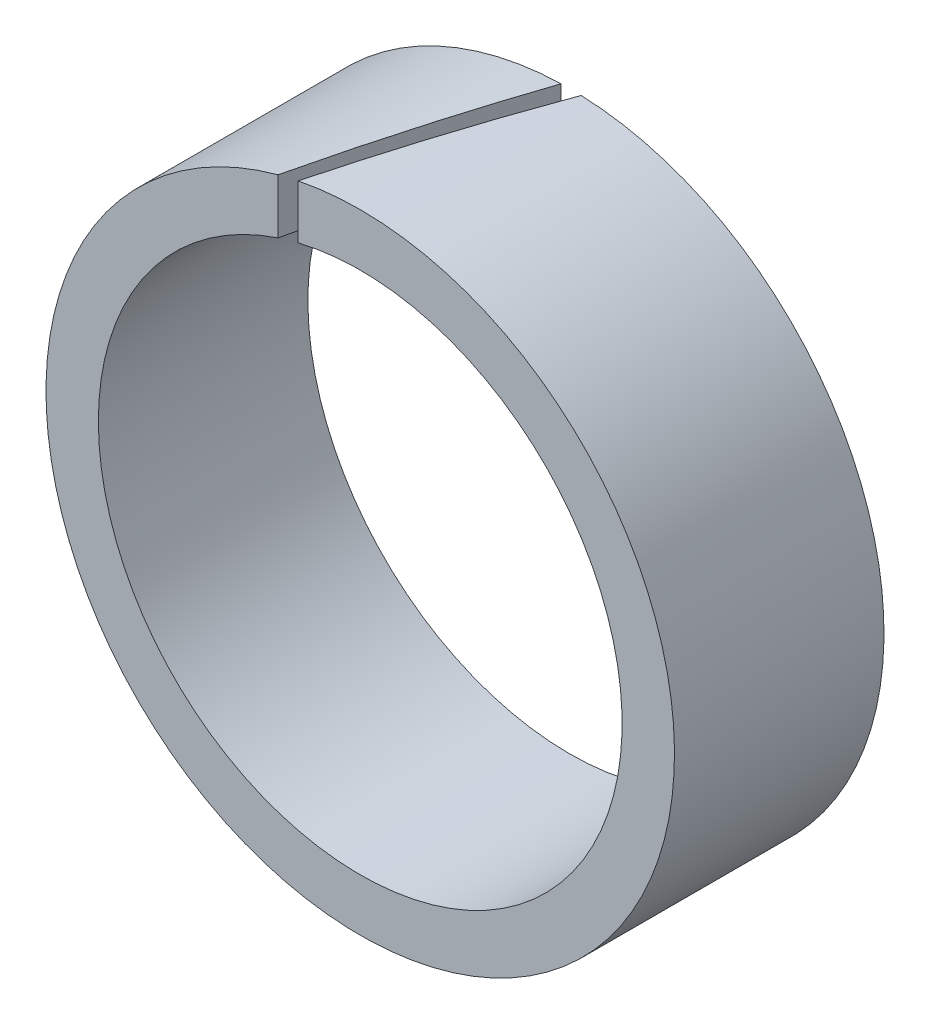
ISO-10303-21;
HEADER;
FILE_DESCRIPTION(('STEP AP214'),'2;1');
FILE_NAME('part.step','',(''),(''),'','','');
FILE_SCHEMA(('AUTOMOTIVE_DESIGN { 1 0 10303 214 1 1 1 1 }'));
ENDSEC;
DATA;
#1=APPLICATION_CONTEXT('core data for automotive mechanical design processes');
#2=APPLICATION_PROTOCOL_DEFINITION('international standard','automotive_design',2000,#1);
#3=PRODUCT_CONTEXT('',#1,'mechanical');
#4=PRODUCT('Part','Part','',(#3));
#5=PRODUCT_RELATED_PRODUCT_CATEGORY('part','',(#4));
#6=PRODUCT_DEFINITION_FORMATION('','',#4);
#7=PRODUCT_DEFINITION_CONTEXT('part definition',#1,'design');
#8=PRODUCT_DEFINITION('design','',#6,#7);
#9=PRODUCT_DEFINITION_SHAPE('','',#8);
#10=(LENGTH_UNIT() NAMED_UNIT(*) SI_UNIT(.MILLI.,.METRE.));
#11=(NAMED_UNIT(*) PLANE_ANGLE_UNIT() SI_UNIT($,.RADIAN.));
#12=(NAMED_UNIT(*) SI_UNIT($,.STERADIAN.) SOLID_ANGLE_UNIT());
#13=UNCERTAINTY_MEASURE_WITH_UNIT(LENGTH_MEASURE(1.E-05),#10,'distance_accuracy_value','');
#14=(GEOMETRIC_REPRESENTATION_CONTEXT(3) GLOBAL_UNCERTAINTY_ASSIGNED_CONTEXT((#13)) GLOBAL_UNIT_ASSIGNED_CONTEXT((#10,
#11,#12)) REPRESENTATION_CONTEXT('',''));
#15=CARTESIAN_POINT('',(0.,0.,0.));
#16=DIRECTION('',(0.,0.,1.));
#17=DIRECTION('',(1.,0.,0.));
#18=AXIS2_PLACEMENT_3D('',#15,#16,#17);
#19=CARTESIAN_POINT('',(0.,0.,10.));
#20=DIRECTION('',(0.,0.,1.));
#21=DIRECTION('',(1.,0.,0.));
#22=AXIS2_PLACEMENT_3D('',#19,#20,#21);
#23=PLANE('',#22);
#24=DIRECTION('',(0.,1.,0.));
#25=VECTOR('',#24,1.);
#26=CARTESIAN_POINT('',(-2.96629132659677,0.,10.));
#27=LINE('',#26,#25);
#28=CARTESIAN_POINT('',(-2.96629132659677,12.1429451026412,10.));
#29=VERTEX_POINT('',#28);
#30=CARTESIAN_POINT('',(-2.96629132659677,14.7037789620817,10.));
#31=VERTEX_POINT('',#30);
#32=EDGE_CURVE('E91',#29,#31,#27,.T.);
#33=ORIENTED_EDGE('',*,*,#32,.F.);
#34=CARTESIAN_POINT('',(0.,0.,10.));
#35=DIRECTION('',(0.,0.,1.));
#36=DIRECTION('',(1.,0.,0.));
#37=AXIS2_PLACEMENT_3D('',#34,#35,#36);
#38=CIRCLE('',#37,12.5);
#39=CARTESIAN_POINT('',(-3.92477986225866,11.8678600865029,10.));
#40=VERTEX_POINT('',#39);
#41=EDGE_CURVE('E87',#40,#29,#38,.T.);
#42=ORIENTED_EDGE('',*,*,#41,.F.);
#43=DIRECTION('',(0.,-1.,0.));
#44=VECTOR('',#43,1.);
#45=CARTESIAN_POINT('',(-3.92477986225866,0.,10.));
#46=LINE('',#45,#44);
#47=CARTESIAN_POINT('',(-3.92477986225866,14.4774342696767,10.));
#48=VERTEX_POINT('',#47);
#49=EDGE_CURVE('E54',#48,#40,#46,.T.);
#50=ORIENTED_EDGE('',*,*,#49,.F.);
#51=CARTESIAN_POINT('',(0.,0.,10.));
#52=DIRECTION('',(0.,0.,1.));
#53=DIRECTION('',(1.,0.,0.));
#54=AXIS2_PLACEMENT_3D('',#51,#52,#53);
#55=CIRCLE('',#54,15.);
#56=EDGE_CURVE('E77',#48,#31,#55,.T.);
#57=ORIENTED_EDGE('',*,*,#56,.T.);
#58=EDGE_LOOP('',(#33,#42,#50,#57));
#59=FACE_BOUND('',#58,.T.);
#60=ADVANCED_FACE('F32',(#59),#23,.T.);
#61=CARTESIAN_POINT('',(0.,0.,0.));
#62=DIRECTION('',(0.,0.,1.));
#63=DIRECTION('',(1.,0.,0.));
#64=AXIS2_PLACEMENT_3D('',#61,#62,#63);
#65=PLANE('',#64);
#66=CARTESIAN_POINT('',(0.,0.,0.));
#67=DIRECTION('',(0.,0.,1.));
#68=DIRECTION('',(1.,0.,0.));
#69=AXIS2_PLACEMENT_3D('',#66,#67,#68);
#70=CIRCLE('',#69,12.5);
#71=CARTESIAN_POINT('',(-0.414256442370753,12.4931337781981,0.));
#72=VERTEX_POINT('',#71);
#73=CARTESIAN_POINT('',(0.544232093291136,12.4881468372466,0.));
#74=VERTEX_POINT('',#73);
#75=EDGE_CURVE('E82',#72,#74,#70,.T.);
#76=ORIENTED_EDGE('',*,*,#75,.T.);
#77=DIRECTION('',(0.,1.,0.));
#78=VECTOR('',#77,1.);
#79=CARTESIAN_POINT('',(0.544232093291136,0.,0.));
#80=LINE('',#79,#78);
#81=CARTESIAN_POINT('',(0.544232093291136,14.9901237963078,0.));
#82=VERTEX_POINT('',#81);
#83=EDGE_CURVE('E46',#74,#82,#80,.T.);
#84=ORIENTED_EDGE('',*,*,#83,.T.);
#85=CARTESIAN_POINT('',(0.,0.,0.));
#86=DIRECTION('',(0.,0.,1.));
#87=DIRECTION('',(1.,0.,0.));
#88=AXIS2_PLACEMENT_3D('',#85,#86,#87);
#89=CIRCLE('',#88,15.);
#90=CARTESIAN_POINT('',(-0.414256442370753,14.9942786288622,0.));
#91=VERTEX_POINT('',#90);
#92=EDGE_CURVE('E84',#91,#82,#89,.T.);
#93=ORIENTED_EDGE('',*,*,#92,.F.);
#94=DIRECTION('',(0.,-1.,0.));
#95=VECTOR('',#94,1.);
#96=CARTESIAN_POINT('',(-0.414256442370753,0.,0.));
#97=LINE('',#96,#95);
#98=EDGE_CURVE('E71',#91,#72,#97,.T.);
#99=ORIENTED_EDGE('',*,*,#98,.T.);
#100=EDGE_LOOP('',(#76,#84,#93,#99));
#101=FACE_BOUND('',#100,.T.);
#102=ADVANCED_FACE('F81',(#101),#65,.F.);
#103=CARTESIAN_POINT('',(0.,0.,10.));
#104=DIRECTION('',(0.,0.,-1.));
#105=DIRECTION('',(-1.,0.,0.));
#106=AXIS2_PLACEMENT_3D('',#103,#104,#105);
#107=CYLINDRICAL_SURFACE('',#106,15.);
#108=ORIENTED_EDGE('',*,*,#92,.T.);
#109=CARTESIAN_POINT('',(0.,0.,1.55028760158083));
#110=DIRECTION('',(0.943548340577139,0.,0.331234854739242));
#111=DIRECTION('',(0.331234854739242,0.,-0.943548340577139));
#112=AXIS2_PLACEMENT_3D('',#109,#110,#111);
#113=ELLIPSE('',#112,45.2850893720362,15.);
#114=EDGE_CURVE('E88',#82,#31,#113,.T.);
#115=ORIENTED_EDGE('',*,*,#114,.T.);
#116=ORIENTED_EDGE('',*,*,#56,.F.);
#117=CARTESIAN_POINT('',(0.,0.,-1.18004181377597));
#118=DIRECTION('',(-0.943548340577139,0.,-0.331234854739242));
#119=DIRECTION('',(0.331234854739242,0.,-0.94354834057714));
#120=AXIS2_PLACEMENT_3D('',#117,#118,#119);
#121=ELLIPSE('',#120,45.2850893720362,15.);
#122=EDGE_CURVE('E99',#48,#91,#121,.T.);
#123=ORIENTED_EDGE('',*,*,#122,.T.);
#124=EDGE_LOOP('',(#108,#115,#116,#123));
#125=FACE_BOUND('',#124,.T.);
#126=ADVANCED_FACE('F34',(#125),#107,.T.);
#127=CARTESIAN_POINT('',(0.,0.,10.));
#128=DIRECTION('',(0.,0.,-1.));
#129=DIRECTION('',(-1.,0.,0.));
#130=AXIS2_PLACEMENT_3D('',#127,#128,#129);
#131=CYLINDRICAL_SURFACE('',#130,12.5);
#132=CARTESIAN_POINT('',(0.,0.,1.55028760158083));
#133=DIRECTION('',(0.943548340577139,0.,0.331234854739242));
#134=DIRECTION('',(0.331234854739242,0.,-0.943548340577139));
#135=AXIS2_PLACEMENT_3D('',#132,#133,#134);
#136=ELLIPSE('',#135,37.7375744766968,12.5);
#137=EDGE_CURVE('E11',#74,#29,#136,.T.);
#138=ORIENTED_EDGE('',*,*,#137,.F.);
#139=ORIENTED_EDGE('',*,*,#75,.F.);
#140=CARTESIAN_POINT('',(0.,0.,-1.18004181377597));
#141=DIRECTION('',(-0.943548340577139,0.,-0.331234854739242));
#142=DIRECTION('',(0.331234854739242,0.,-0.94354834057714));
#143=AXIS2_PLACEMENT_3D('',#140,#141,#142);
#144=ELLIPSE('',#143,37.7375744766969,12.5);
#145=EDGE_CURVE('E40',#40,#72,#144,.T.);
#146=ORIENTED_EDGE('',*,*,#145,.F.);
#147=ORIENTED_EDGE('',*,*,#41,.T.);
#148=EDGE_LOOP('',(#138,#139,#146,#147));
#149=FACE_BOUND('',#148,.T.);
#150=ADVANCED_FACE('F86',(#149),#131,.F.);
#151=CARTESIAN_POINT('',(0.693116527176799,5.,-3.15443834749552));
#152=DIRECTION('',(-0.943548340577139,0.,-0.331234854739242));
#153=DIRECTION('',(-0.331234854739242,0.,0.94354834057714));
#154=AXIS2_PLACEMENT_3D('',#151,#152,#153);
#155=PLANE('',#154);
#156=ORIENTED_EDGE('',*,*,#49,.T.);
#157=ORIENTED_EDGE('',*,*,#145,.T.);
#158=ORIENTED_EDGE('',*,*,#98,.F.);
#159=ORIENTED_EDGE('',*,*,#122,.F.);
#160=EDGE_LOOP('',(#156,#157,#158,#159));
#161=FACE_BOUND('',#160,.T.);
#162=ADVANCED_FACE('F70',(#161),#155,.F.);
#163=CARTESIAN_POINT('',(1.60687633678895,5.,-3.02702507972941));
#164=DIRECTION('',(0.943548340577139,0.,0.331234854739242));
#165=DIRECTION('',(0.331234854739242,0.,-0.943548340577139));
#166=AXIS2_PLACEMENT_3D('',#163,#164,#165);
#167=PLANE('',#166);
#168=ORIENTED_EDGE('',*,*,#83,.F.);
#169=ORIENTED_EDGE('',*,*,#137,.T.);
#170=ORIENTED_EDGE('',*,*,#32,.T.);
#171=ORIENTED_EDGE('',*,*,#114,.F.);
#172=EDGE_LOOP('',(#168,#169,#170,#171));
#173=FACE_BOUND('',#172,.T.);
#174=ADVANCED_FACE('F105',(#173),#167,.F.);
#175=CLOSED_SHELL('',(#60,#102,#126,#150,#162,#174));
#176=MANIFOLD_SOLID_BREP('B2',#175);
#177=ADVANCED_BREP_SHAPE_REPRESENTATION('',(#18,#176),#14);
#178=SHAPE_DEFINITION_REPRESENTATION(#9,#177);
ENDSEC;
END-ISO-10303-21;
